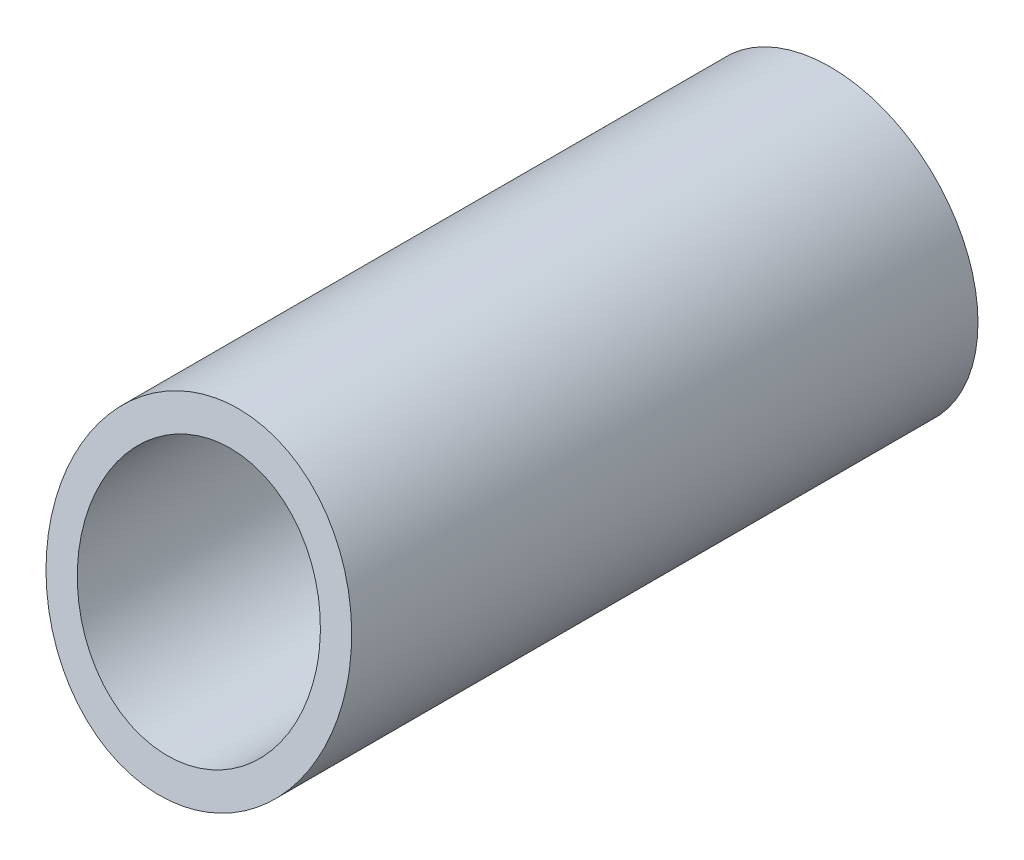
ISO-10303-21;
HEADER;
FILE_DESCRIPTION(('STEP AP214'),'2;1');
FILE_NAME('part.step','',(''),(''),'','','');
FILE_SCHEMA(('AUTOMOTIVE_DESIGN { 1 0 10303 214 1 1 1 1 }'));
ENDSEC;
DATA;
#1=APPLICATION_CONTEXT('core data for automotive mechanical design processes');
#2=APPLICATION_PROTOCOL_DEFINITION('international standard','automotive_design',2000,#1);
#3=PRODUCT_CONTEXT('',#1,'mechanical');
#4=PRODUCT('Part','Part','',(#3));
#5=PRODUCT_RELATED_PRODUCT_CATEGORY('part','',(#4));
#6=PRODUCT_DEFINITION_FORMATION('','',#4);
#7=PRODUCT_DEFINITION_CONTEXT('part definition',#1,'design');
#8=PRODUCT_DEFINITION('design','',#6,#7);
#9=PRODUCT_DEFINITION_SHAPE('','',#8);
#10=(LENGTH_UNIT() NAMED_UNIT(*) SI_UNIT(.MILLI.,.METRE.));
#11=(NAMED_UNIT(*) PLANE_ANGLE_UNIT() SI_UNIT($,.RADIAN.));
#12=(NAMED_UNIT(*) SI_UNIT($,.STERADIAN.) SOLID_ANGLE_UNIT());
#13=UNCERTAINTY_MEASURE_WITH_UNIT(LENGTH_MEASURE(1.E-05),#10,'distance_accuracy_value','');
#14=(GEOMETRIC_REPRESENTATION_CONTEXT(3) GLOBAL_UNCERTAINTY_ASSIGNED_CONTEXT((#13)) GLOBAL_UNIT_ASSIGNED_CONTEXT((#10,
#11,#12)) REPRESENTATION_CONTEXT('',''));
#15=CARTESIAN_POINT('',(0.,0.,0.));
#16=DIRECTION('',(0.,0.,1.));
#17=DIRECTION('',(1.,0.,0.));
#18=AXIS2_PLACEMENT_3D('',#15,#16,#17);
#19=CARTESIAN_POINT('',(0.,0.,38.1));
#20=DIRECTION('',(0.,0.,-1.));
#21=DIRECTION('',(0.,-1.,0.));
#22=AXIS2_PLACEMENT_3D('',#19,#20,#21);
#23=CYLINDRICAL_SURFACE('',#22,13.335);
#24=CARTESIAN_POINT('',(0.,0.,33.6080997380848));
#25=DIRECTION('',(0.,-0.258819045102511,-0.965925826289071));
#26=DIRECTION('',(0.,0.965925826289071,-0.258819045102511));
#27=AXIS2_PLACEMENT_3D('',#24,#25,#26);
#28=ELLIPSE('',#27,13.8054078657685,13.335);
#29=CARTESIAN_POINT('',(0.,13.3350000000001,30.0349972570159));
#30=VERTEX_POINT('',#29);
#31=EDGE_CURVE('E28',#30,#30,#28,.T.);
#32=ORIENTED_EDGE('',*,*,#31,.F.);
#33=EDGE_LOOP('',(#32));
#34=FACE_BOUND('',#33,.T.);
#35=CARTESIAN_POINT('',(0.,0.,-38.1));
#36=DIRECTION('',(0.,0.,1.));
#37=DIRECTION('',(1.,0.,0.));
#38=AXIS2_PLACEMENT_3D('',#35,#36,#37);
#39=CIRCLE('',#38,13.335);
#40=CARTESIAN_POINT('',(13.335,0.,-38.1));
#41=VERTEX_POINT('',#40);
#42=EDGE_CURVE('E24',#41,#41,#39,.T.);
#43=ORIENTED_EDGE('',*,*,#42,.F.);
#44=EDGE_LOOP('',(#43));
#45=FACE_BOUND('',#44,.T.);
#46=ADVANCED_FACE('F14',(#34,#45),#23,.F.);
#47=CARTESIAN_POINT('',(0.,0.,38.1));
#48=DIRECTION('',(0.,0.,-1.));
#49=DIRECTION('',(0.,-1.,0.));
#50=AXIS2_PLACEMENT_3D('',#47,#48,#49);
#51=CYLINDRICAL_SURFACE('',#50,16.764);
#52=CARTESIAN_POINT('',(0.,0.,33.6080997380848));
#53=DIRECTION('',(0.,-0.258819045102511,-0.965925826289071));
#54=DIRECTION('',(0.,0.965925826289071,-0.258819045102511));
#55=AXIS2_PLACEMENT_3D('',#52,#53,#54);
#56=ELLIPSE('',#55,17.3553698883946,16.764);
#57=CARTESIAN_POINT('',(0.,16.764,29.1161994761697));
#58=VERTEX_POINT('',#57);
#59=EDGE_CURVE('E9',#58,#58,#56,.T.);
#60=ORIENTED_EDGE('',*,*,#59,.T.);
#61=EDGE_LOOP('',(#60));
#62=FACE_BOUND('',#61,.T.);
#63=CARTESIAN_POINT('',(0.,0.,-38.1));
#64=DIRECTION('',(0.,0.,1.));
#65=DIRECTION('',(1.,0.,0.));
#66=AXIS2_PLACEMENT_3D('',#63,#64,#65);
#67=CIRCLE('',#66,16.764);
#68=CARTESIAN_POINT('',(16.764,0.,-38.1));
#69=VERTEX_POINT('',#68);
#70=EDGE_CURVE('E17',#69,#69,#67,.T.);
#71=ORIENTED_EDGE('',*,*,#70,.T.);
#72=EDGE_LOOP('',(#71));
#73=FACE_BOUND('',#72,.T.);
#74=ADVANCED_FACE('F36',(#62,#73),#51,.T.);
#75=CARTESIAN_POINT('',(0.,0.,-38.1));
#76=DIRECTION('',(0.,0.,1.));
#77=DIRECTION('',(1.,0.,0.));
#78=AXIS2_PLACEMENT_3D('',#75,#76,#77);
#79=PLANE('',#78);
#80=ORIENTED_EDGE('',*,*,#70,.F.);
#81=EDGE_LOOP('',(#80));
#82=FACE_BOUND('',#81,.T.);
#83=ORIENTED_EDGE('',*,*,#42,.T.);
#84=EDGE_LOOP('',(#83));
#85=FACE_BOUND('',#84,.T.);
#86=ADVANCED_FACE('F39',(#82,#85),#79,.F.);
#87=CARTESIAN_POINT('',(-16.764,-16.764,38.1));
#88=DIRECTION('',(0.,-0.258819045102511,-0.965925826289071));
#89=DIRECTION('',(0.,0.965925826289071,-0.258819045102511));
#90=AXIS2_PLACEMENT_3D('',#87,#88,#89);
#91=PLANE('',#90);
#92=ORIENTED_EDGE('',*,*,#59,.F.);
#93=EDGE_LOOP('',(#92));
#94=FACE_BOUND('',#93,.T.);
#95=ORIENTED_EDGE('',*,*,#31,.T.);
#96=EDGE_LOOP('',(#95));
#97=FACE_BOUND('',#96,.T.);
#98=ADVANCED_FACE('F32',(#94,#97),#91,.F.);
#99=CLOSED_SHELL('',(#46,#74,#86,#98));
#100=MANIFOLD_SOLID_BREP('B1',#99);
#101=ADVANCED_BREP_SHAPE_REPRESENTATION('',(#18,#100),#14);
#102=SHAPE_DEFINITION_REPRESENTATION(#9,#101);
ENDSEC;
END-ISO-10303-21;
